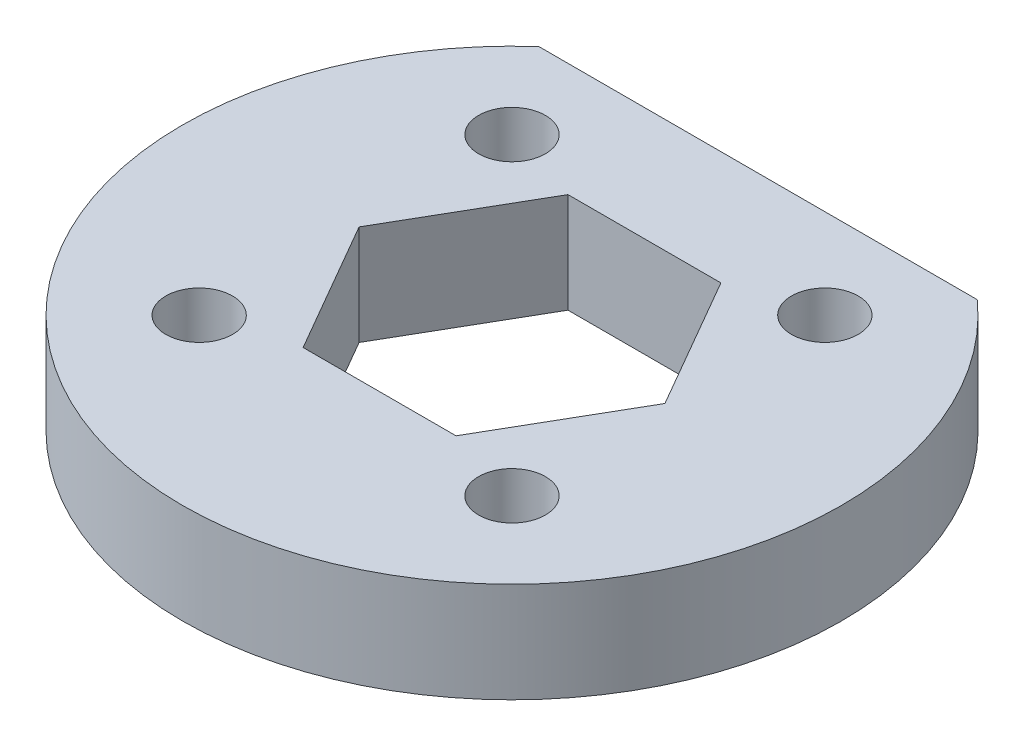
ISO-10303-21;
HEADER;
FILE_DESCRIPTION(('STEP AP214'),'2;1');
FILE_NAME('part.step','',(''),(''),'','','');
FILE_SCHEMA(('AUTOMOTIVE_DESIGN { 1 0 10303 214 1 1 1 1 }'));
ENDSEC;
DATA;
#1=APPLICATION_CONTEXT('core data for automotive mechanical design processes');
#2=APPLICATION_PROTOCOL_DEFINITION('international standard','automotive_design',2000,#1);
#3=PRODUCT_CONTEXT('',#1,'mechanical');
#4=PRODUCT('Part','Part','',(#3));
#5=PRODUCT_RELATED_PRODUCT_CATEGORY('part','',(#4));
#6=PRODUCT_DEFINITION_FORMATION('','',#4);
#7=PRODUCT_DEFINITION_CONTEXT('part definition',#1,'design');
#8=PRODUCT_DEFINITION('design','',#6,#7);
#9=PRODUCT_DEFINITION_SHAPE('','',#8);
#10=(LENGTH_UNIT() NAMED_UNIT(*) SI_UNIT(.MILLI.,.METRE.));
#11=(NAMED_UNIT(*) PLANE_ANGLE_UNIT() SI_UNIT($,.RADIAN.));
#12=(NAMED_UNIT(*) SI_UNIT($,.STERADIAN.) SOLID_ANGLE_UNIT());
#13=UNCERTAINTY_MEASURE_WITH_UNIT(LENGTH_MEASURE(1.E-05),#10,'distance_accuracy_value','');
#14=(GEOMETRIC_REPRESENTATION_CONTEXT(3) GLOBAL_UNCERTAINTY_ASSIGNED_CONTEXT((#13)) GLOBAL_UNIT_ASSIGNED_CONTEXT((#10,
#11,#12)) REPRESENTATION_CONTEXT('',''));
#15=CARTESIAN_POINT('',(0.,0.,0.));
#16=DIRECTION('',(0.,0.,1.));
#17=DIRECTION('',(1.,0.,0.));
#18=AXIS2_PLACEMENT_3D('',#15,#16,#17);
#19=CARTESIAN_POINT('',(0.,0.,0.));
#20=DIRECTION('',(0.,1.,0.));
#21=DIRECTION('',(1.,0.,0.));
#22=AXIS2_PLACEMENT_3D('',#19,#20,#21);
#23=PLANE('',#22);
#24=CARTESIAN_POINT('',(0.,0.,0.));
#25=DIRECTION('',(0.,-1.,0.));
#26=DIRECTION('',(0.665008887927277,0.,-0.746835443037974));
#27=AXIS2_PLACEMENT_3D('',#24,#25,#26);
#28=CIRCLE('',#27,15.8);
#29=CARTESIAN_POINT('',(10.50714042925,0.,-11.8));
#30=VERTEX_POINT('',#29);
#31=CARTESIAN_POINT('',(-10.50714042925,0.,-11.8));
#32=VERTEX_POINT('',#31);
#33=EDGE_CURVE('E11',#30,#32,#28,.T.);
#34=ORIENTED_EDGE('',*,*,#33,.T.);
#35=DIRECTION('',(1.,0.,0.));
#36=VECTOR('',#35,1.);
#37=CARTESIAN_POINT('',(-10.50714042925,0.,-11.8));
#38=LINE('',#37,#36);
#39=EDGE_CURVE('E27',#32,#30,#38,.T.);
#40=ORIENTED_EDGE('',*,*,#39,.T.);
#41=EDGE_LOOP('',(#34,#40));
#42=FACE_BOUND('',#41,.T.);
#43=DIRECTION('',(0.500000000000017,0.,0.866025403784429));
#44=VECTOR('',#43,1.);
#45=CARTESIAN_POINT('',(-7.332348418708,0.,0.));
#46=LINE('',#45,#44);
#47=CARTESIAN_POINT('',(-7.332348418708,0.,0.));
#48=VERTEX_POINT('',#47);
#49=CARTESIAN_POINT('',(-3.666174209354,0.,6.35));
#50=VERTEX_POINT('',#49);
#51=EDGE_CURVE('E334',#48,#50,#46,.T.);
#52=ORIENTED_EDGE('',*,*,#51,.T.);
#53=DIRECTION('',(1.,0.,0.));
#54=VECTOR('',#53,1.);
#55=CARTESIAN_POINT('',(-3.666174209354,0.,6.35));
#56=LINE('',#55,#54);
#57=CARTESIAN_POINT('',(3.666174209354,0.,6.35));
#58=VERTEX_POINT('',#57);
#59=EDGE_CURVE('E331',#50,#58,#56,.T.);
#60=ORIENTED_EDGE('',*,*,#59,.T.);
#61=DIRECTION('',(0.500000000000017,0.,-0.866025403784429));
#62=VECTOR('',#61,1.);
#63=CARTESIAN_POINT('',(3.666174209354,0.,6.35));
#64=LINE('',#63,#62);
#65=CARTESIAN_POINT('',(7.332348418708,0.,0.));
#66=VERTEX_POINT('',#65);
#67=EDGE_CURVE('E327',#58,#66,#64,.T.);
#68=ORIENTED_EDGE('',*,*,#67,.T.);
#69=DIRECTION('',(-0.500000000000017,0.,-0.866025403784429));
#70=VECTOR('',#69,1.);
#71=CARTESIAN_POINT('',(7.332348418708,0.,0.));
#72=LINE('',#71,#70);
#73=CARTESIAN_POINT('',(3.666174209354,0.,-6.35));
#74=VERTEX_POINT('',#73);
#75=EDGE_CURVE('E326',#66,#74,#72,.T.);
#76=ORIENTED_EDGE('',*,*,#75,.T.);
#77=DIRECTION('',(-1.,0.,0.));
#78=VECTOR('',#77,1.);
#79=CARTESIAN_POINT('',(3.666174209354,0.,-6.35));
#80=LINE('',#79,#78);
#81=CARTESIAN_POINT('',(-3.666174209354,0.,-6.35));
#82=VERTEX_POINT('',#81);
#83=EDGE_CURVE('E315',#74,#82,#80,.T.);
#84=ORIENTED_EDGE('',*,*,#83,.T.);
#85=DIRECTION('',(-0.500000000000017,0.,0.866025403784429));
#86=VECTOR('',#85,1.);
#87=CARTESIAN_POINT('',(-3.666174209354,0.,-6.35));
#88=LINE('',#87,#86);
#89=EDGE_CURVE('E104',#82,#48,#88,.T.);
#90=ORIENTED_EDGE('',*,*,#89,.T.);
#91=EDGE_LOOP('',(#52,#60,#68,#76,#84,#90));
#92=FACE_BOUND('',#91,.T.);
#93=CARTESIAN_POINT('',(-7.5,0.,-7.5));
#94=DIRECTION('',(0.,-1.,0.));
#95=DIRECTION('',(-1.,0.,0.));
#96=AXIS2_PLACEMENT_3D('',#93,#94,#95);
#97=CIRCLE('',#96,1.6);
#98=CARTESIAN_POINT('',(-9.1,0.,-7.5));
#99=VERTEX_POINT('',#98);
#100=EDGE_CURVE('E94',#99,#99,#97,.T.);
#101=ORIENTED_EDGE('',*,*,#100,.F.);
#102=EDGE_LOOP('',(#101));
#103=FACE_BOUND('',#102,.T.);
#104=CARTESIAN_POINT('',(-7.5,0.,7.5));
#105=DIRECTION('',(0.,-1.,0.));
#106=DIRECTION('',(0.,0.,1.));
#107=AXIS2_PLACEMENT_3D('',#104,#105,#106);
#108=CIRCLE('',#107,1.6);
#109=CARTESIAN_POINT('',(-7.5,0.,9.1));
#110=VERTEX_POINT('',#109);
#111=EDGE_CURVE('E96',#110,#110,#108,.T.);
#112=ORIENTED_EDGE('',*,*,#111,.F.);
#113=EDGE_LOOP('',(#112));
#114=FACE_BOUND('',#113,.T.);
#115=CARTESIAN_POINT('',(7.5,0.,7.5));
#116=DIRECTION('',(0.,-1.,0.));
#117=DIRECTION('',(1.,0.,0.));
#118=AXIS2_PLACEMENT_3D('',#115,#116,#117);
#119=CIRCLE('',#118,1.6);
#120=CARTESIAN_POINT('',(9.1,0.,7.5));
#121=VERTEX_POINT('',#120);
#122=EDGE_CURVE('E101',#121,#121,#119,.T.);
#123=ORIENTED_EDGE('',*,*,#122,.F.);
#124=EDGE_LOOP('',(#123));
#125=FACE_BOUND('',#124,.T.);
#126=CARTESIAN_POINT('',(7.5,0.,-7.5));
#127=DIRECTION('',(0.,-1.,0.));
#128=DIRECTION('',(0.,0.,-1.));
#129=AXIS2_PLACEMENT_3D('',#126,#127,#128);
#130=CIRCLE('',#129,1.6);
#131=CARTESIAN_POINT('',(7.5,0.,-9.1));
#132=VERTEX_POINT('',#131);
#133=EDGE_CURVE('E109',#132,#132,#130,.T.);
#134=ORIENTED_EDGE('',*,*,#133,.F.);
#135=EDGE_LOOP('',(#134));
#136=FACE_BOUND('',#135,.T.);
#137=ADVANCED_FACE('F17',(#42,#92,#103,#114,#125,#136),#23,.F.);
#138=CARTESIAN_POINT('',(-3.666174209354,4.8,-6.35));
#139=DIRECTION('',(-0.866025403784429,0.,-0.500000000000017));
#140=DIRECTION('',(-0.500000000000017,0.,0.866025403784429));
#141=AXIS2_PLACEMENT_3D('',#138,#139,#140);
#142=PLANE('',#141);
#143=DIRECTION('',(0.,-1.,0.));
#144=VECTOR('',#143,1.);
#145=CARTESIAN_POINT('',(-3.666174209354,4.8,-6.35));
#146=LINE('',#145,#144);
#147=CARTESIAN_POINT('',(-3.666174209354,4.8,-6.35));
#148=VERTEX_POINT('',#147);
#149=EDGE_CURVE('E89',#148,#82,#146,.T.);
#150=ORIENTED_EDGE('',*,*,#149,.F.);
#151=DIRECTION('',(-0.500000000000017,0.,0.866025403784429));
#152=VECTOR('',#151,1.);
#153=CARTESIAN_POINT('',(-3.666174209354,4.8,-6.35));
#154=LINE('',#153,#152);
#155=CARTESIAN_POINT('',(-7.332348418708,4.8,0.));
#156=VERTEX_POINT('',#155);
#157=EDGE_CURVE('E115',#148,#156,#154,.T.);
#158=ORIENTED_EDGE('',*,*,#157,.T.);
#159=DIRECTION('',(0.,-1.,0.));
#160=VECTOR('',#159,1.);
#161=CARTESIAN_POINT('',(-7.332348418708,4.8,0.));
#162=LINE('',#161,#160);
#163=EDGE_CURVE('E118',#156,#48,#162,.T.);
#164=ORIENTED_EDGE('',*,*,#163,.T.);
#165=ORIENTED_EDGE('',*,*,#89,.F.);
#166=EDGE_LOOP('',(#150,#158,#164,#165));
#167=FACE_BOUND('',#166,.T.);
#168=ADVANCED_FACE('F170',(#167),#142,.F.);
#169=CARTESIAN_POINT('',(-7.332348418708,4.8,0.));
#170=DIRECTION('',(-0.866025403784429,0.,0.500000000000017));
#171=DIRECTION('',(0.500000000000017,0.,0.866025403784429));
#172=AXIS2_PLACEMENT_3D('',#169,#170,#171);
#173=PLANE('',#172);
#174=ORIENTED_EDGE('',*,*,#163,.F.);
#175=DIRECTION('',(0.500000000000017,0.,0.866025403784429));
#176=VECTOR('',#175,1.);
#177=CARTESIAN_POINT('',(-7.332348418708,4.8,0.));
#178=LINE('',#177,#176);
#179=CARTESIAN_POINT('',(-3.666174209354,4.8,6.35));
#180=VERTEX_POINT('',#179);
#181=EDGE_CURVE('E121',#156,#180,#178,.T.);
#182=ORIENTED_EDGE('',*,*,#181,.T.);
#183=DIRECTION('',(0.,-1.,0.));
#184=VECTOR('',#183,1.);
#185=CARTESIAN_POINT('',(-3.666174209354,4.8,6.35));
#186=LINE('',#185,#184);
#187=EDGE_CURVE('E124',#180,#50,#186,.T.);
#188=ORIENTED_EDGE('',*,*,#187,.T.);
#189=ORIENTED_EDGE('',*,*,#51,.F.);
#190=EDGE_LOOP('',(#174,#182,#188,#189));
#191=FACE_BOUND('',#190,.T.);
#192=ADVANCED_FACE('F176',(#191),#173,.F.);
#193=CARTESIAN_POINT('',(-3.666174209354,4.8,6.35));
#194=DIRECTION('',(0.,0.,1.));
#195=DIRECTION('',(1.,0.,0.));
#196=AXIS2_PLACEMENT_3D('',#193,#194,#195);
#197=PLANE('',#196);
#198=ORIENTED_EDGE('',*,*,#187,.F.);
#199=DIRECTION('',(1.,0.,0.));
#200=VECTOR('',#199,1.);
#201=CARTESIAN_POINT('',(-3.666174209354,4.8,6.35));
#202=LINE('',#201,#200);
#203=CARTESIAN_POINT('',(3.666174209354,4.8,6.35));
#204=VERTEX_POINT('',#203);
#205=EDGE_CURVE('E127',#180,#204,#202,.T.);
#206=ORIENTED_EDGE('',*,*,#205,.T.);
#207=DIRECTION('',(0.,-1.,0.));
#208=VECTOR('',#207,1.);
#209=CARTESIAN_POINT('',(3.666174209354,4.8,6.35));
#210=LINE('',#209,#208);
#211=EDGE_CURVE('E130',#204,#58,#210,.T.);
#212=ORIENTED_EDGE('',*,*,#211,.T.);
#213=ORIENTED_EDGE('',*,*,#59,.F.);
#214=EDGE_LOOP('',(#198,#206,#212,#213));
#215=FACE_BOUND('',#214,.T.);
#216=ADVANCED_FACE('F183',(#215),#197,.F.);
#217=CARTESIAN_POINT('',(3.666174209354,4.8,6.35));
#218=DIRECTION('',(0.866025403784429,0.,0.500000000000017));
#219=DIRECTION('',(0.500000000000017,0.,-0.866025403784429));
#220=AXIS2_PLACEMENT_3D('',#217,#218,#219);
#221=PLANE('',#220);
#222=ORIENTED_EDGE('',*,*,#211,.F.);
#223=DIRECTION('',(0.500000000000017,0.,-0.866025403784429));
#224=VECTOR('',#223,1.);
#225=CARTESIAN_POINT('',(3.666174209354,4.8,6.35));
#226=LINE('',#225,#224);
#227=CARTESIAN_POINT('',(7.332348418708,4.8,0.));
#228=VERTEX_POINT('',#227);
#229=EDGE_CURVE('E133',#204,#228,#226,.T.);
#230=ORIENTED_EDGE('',*,*,#229,.T.);
#231=DIRECTION('',(0.,-1.,0.));
#232=VECTOR('',#231,1.);
#233=CARTESIAN_POINT('',(7.332348418708,4.8,0.));
#234=LINE('',#233,#232);
#235=EDGE_CURVE('E136',#228,#66,#234,.T.);
#236=ORIENTED_EDGE('',*,*,#235,.T.);
#237=ORIENTED_EDGE('',*,*,#67,.F.);
#238=EDGE_LOOP('',(#222,#230,#236,#237));
#239=FACE_BOUND('',#238,.T.);
#240=ADVANCED_FACE('F187',(#239),#221,.F.);
#241=CARTESIAN_POINT('',(7.332348418708,4.8,0.));
#242=DIRECTION('',(0.866025403784429,0.,-0.500000000000017));
#243=DIRECTION('',(-0.500000000000017,0.,-0.866025403784429));
#244=AXIS2_PLACEMENT_3D('',#241,#242,#243);
#245=PLANE('',#244);
#246=ORIENTED_EDGE('',*,*,#235,.F.);
#247=DIRECTION('',(-0.500000000000017,0.,-0.866025403784429));
#248=VECTOR('',#247,1.);
#249=CARTESIAN_POINT('',(7.332348418708,4.8,0.));
#250=LINE('',#249,#248);
#251=CARTESIAN_POINT('',(3.666174209354,4.8,-6.35));
#252=VERTEX_POINT('',#251);
#253=EDGE_CURVE('E139',#228,#252,#250,.T.);
#254=ORIENTED_EDGE('',*,*,#253,.T.);
#255=DIRECTION('',(0.,-1.,0.));
#256=VECTOR('',#255,1.);
#257=CARTESIAN_POINT('',(3.666174209354,4.8,-6.35));
#258=LINE('',#257,#256);
#259=EDGE_CURVE('E142',#252,#74,#258,.T.);
#260=ORIENTED_EDGE('',*,*,#259,.T.);
#261=ORIENTED_EDGE('',*,*,#75,.F.);
#262=EDGE_LOOP('',(#246,#254,#260,#261));
#263=FACE_BOUND('',#262,.T.);
#264=ADVANCED_FACE('F191',(#263),#245,.F.);
#265=CARTESIAN_POINT('',(3.666174209354,4.8,-6.35));
#266=DIRECTION('',(0.,0.,-1.));
#267=DIRECTION('',(-1.,0.,0.));
#268=AXIS2_PLACEMENT_3D('',#265,#266,#267);
#269=PLANE('',#268);
#270=ORIENTED_EDGE('',*,*,#259,.F.);
#271=DIRECTION('',(-1.,0.,0.));
#272=VECTOR('',#271,1.);
#273=CARTESIAN_POINT('',(3.666174209354,4.8,-6.35));
#274=LINE('',#273,#272);
#275=EDGE_CURVE('E114',#252,#148,#274,.T.);
#276=ORIENTED_EDGE('',*,*,#275,.T.);
#277=ORIENTED_EDGE('',*,*,#149,.T.);
#278=ORIENTED_EDGE('',*,*,#83,.F.);
#279=EDGE_LOOP('',(#270,#276,#277,#278));
#280=FACE_BOUND('',#279,.T.);
#281=ADVANCED_FACE('F195',(#280),#269,.F.);
#282=CARTESIAN_POINT('',(0.,4.8,0.));
#283=DIRECTION('',(0.,1.,0.));
#284=DIRECTION('',(1.,0.,0.));
#285=AXIS2_PLACEMENT_3D('',#282,#283,#284);
#286=PLANE('',#285);
#287=CARTESIAN_POINT('',(0.,4.8,0.));
#288=DIRECTION('',(0.,1.,0.));
#289=DIRECTION('',(-0.665008887927277,0.,-0.746835443037974));
#290=AXIS2_PLACEMENT_3D('',#287,#288,#289);
#291=CIRCLE('',#290,15.8);
#292=CARTESIAN_POINT('',(-10.50714042925,4.8,-11.8));
#293=VERTEX_POINT('',#292);
#294=CARTESIAN_POINT('',(10.50714042925,4.8,-11.8));
#295=VERTEX_POINT('',#294);
#296=EDGE_CURVE('E85',#293,#295,#291,.T.);
#297=ORIENTED_EDGE('',*,*,#296,.T.);
#298=DIRECTION('',(1.,0.,0.));
#299=VECTOR('',#298,1.);
#300=CARTESIAN_POINT('',(-10.50714042925,4.8,-11.8));
#301=LINE('',#300,#299);
#302=EDGE_CURVE('E78',#293,#295,#301,.T.);
#303=ORIENTED_EDGE('',*,*,#302,.F.);
#304=EDGE_LOOP('',(#297,#303));
#305=FACE_BOUND('',#304,.T.);
#306=ORIENTED_EDGE('',*,*,#275,.F.);
#307=ORIENTED_EDGE('',*,*,#253,.F.);
#308=ORIENTED_EDGE('',*,*,#229,.F.);
#309=ORIENTED_EDGE('',*,*,#205,.F.);
#310=ORIENTED_EDGE('',*,*,#181,.F.);
#311=ORIENTED_EDGE('',*,*,#157,.F.);
#312=EDGE_LOOP('',(#306,#307,#308,#309,#310,#311));
#313=FACE_BOUND('',#312,.T.);
#314=CARTESIAN_POINT('',(-7.5,4.8,-7.5));
#315=DIRECTION('',(0.,-1.,0.));
#316=DIRECTION('',(-1.,0.,0.));
#317=AXIS2_PLACEMENT_3D('',#314,#315,#316);
#318=CIRCLE('',#317,1.6);
#319=CARTESIAN_POINT('',(-9.1,4.8,-7.5));
#320=VERTEX_POINT('',#319);
#321=EDGE_CURVE('E90',#320,#320,#318,.T.);
#322=ORIENTED_EDGE('',*,*,#321,.T.);
#323=EDGE_LOOP('',(#322));
#324=FACE_BOUND('',#323,.T.);
#325=CARTESIAN_POINT('',(-7.5,4.8,7.5));
#326=DIRECTION('',(0.,-1.,0.));
#327=DIRECTION('',(0.,0.,1.));
#328=AXIS2_PLACEMENT_3D('',#325,#326,#327);
#329=CIRCLE('',#328,1.6);
#330=CARTESIAN_POINT('',(-7.5,4.8,9.1));
#331=VERTEX_POINT('',#330);
#332=EDGE_CURVE('E149',#331,#331,#329,.T.);
#333=ORIENTED_EDGE('',*,*,#332,.T.);
#334=EDGE_LOOP('',(#333));
#335=FACE_BOUND('',#334,.T.);
#336=CARTESIAN_POINT('',(7.5,4.8,7.5));
#337=DIRECTION('',(0.,-1.,0.));
#338=DIRECTION('',(1.,0.,0.));
#339=AXIS2_PLACEMENT_3D('',#336,#337,#338);
#340=CIRCLE('',#339,1.6);
#341=CARTESIAN_POINT('',(9.1,4.8,7.5));
#342=VERTEX_POINT('',#341);
#343=EDGE_CURVE('E152',#342,#342,#340,.T.);
#344=ORIENTED_EDGE('',*,*,#343,.T.);
#345=EDGE_LOOP('',(#344));
#346=FACE_BOUND('',#345,.T.);
#347=CARTESIAN_POINT('',(7.5,4.8,-7.5));
#348=DIRECTION('',(0.,-1.,0.));
#349=DIRECTION('',(0.,0.,-1.));
#350=AXIS2_PLACEMENT_3D('',#347,#348,#349);
#351=CIRCLE('',#350,1.6);
#352=CARTESIAN_POINT('',(7.5,4.8,-9.1));
#353=VERTEX_POINT('',#352);
#354=EDGE_CURVE('E155',#353,#353,#351,.T.);
#355=ORIENTED_EDGE('',*,*,#354,.T.);
#356=EDGE_LOOP('',(#355));
#357=FACE_BOUND('',#356,.T.);
#358=ADVANCED_FACE('F86',(#305,#313,#324,#335,#346,#357),#286,.T.);
#359=CARTESIAN_POINT('',(-10.50714042925,4.8,-11.8));
#360=DIRECTION('',(0.,0.,1.));
#361=DIRECTION('',(1.,0.,0.));
#362=AXIS2_PLACEMENT_3D('',#359,#360,#361);
#363=PLANE('',#362);
#364=DIRECTION('',(0.,1.,0.));
#365=VECTOR('',#364,1.);
#366=CARTESIAN_POINT('',(-10.50714042925,0.,-11.8));
#367=LINE('',#366,#365);
#368=EDGE_CURVE('E83',#32,#293,#367,.T.);
#369=ORIENTED_EDGE('',*,*,#368,.T.);
#370=ORIENTED_EDGE('',*,*,#302,.T.);
#371=DIRECTION('',(0.,1.,0.));
#372=VECTOR('',#371,1.);
#373=CARTESIAN_POINT('',(10.50714042925,0.,-11.8));
#374=LINE('',#373,#372);
#375=EDGE_CURVE('E21',#30,#295,#374,.T.);
#376=ORIENTED_EDGE('',*,*,#375,.F.);
#377=ORIENTED_EDGE('',*,*,#39,.F.);
#378=EDGE_LOOP('',(#369,#370,#376,#377));
#379=FACE_BOUND('',#378,.T.);
#380=ADVANCED_FACE('F80',(#379),#363,.F.);
#381=CARTESIAN_POINT('',(0.,0.,0.));
#382=DIRECTION('',(0.,1.,0.));
#383=DIRECTION('',(1.,0.,0.));
#384=AXIS2_PLACEMENT_3D('',#381,#382,#383);
#385=CYLINDRICAL_SURFACE('',#384,15.8);
#386=ORIENTED_EDGE('',*,*,#375,.T.);
#387=ORIENTED_EDGE('',*,*,#296,.F.);
#388=ORIENTED_EDGE('',*,*,#368,.F.);
#389=ORIENTED_EDGE('',*,*,#33,.F.);
#390=EDGE_LOOP('',(#386,#387,#388,#389));
#391=FACE_BOUND('',#390,.T.);
#392=ADVANCED_FACE('F93',(#391),#385,.T.);
#393=CARTESIAN_POINT('',(-7.5,4.8,-7.5));
#394=DIRECTION('',(0.,-1.,0.));
#395=DIRECTION('',(1.,0.,0.));
#396=AXIS2_PLACEMENT_3D('',#393,#394,#395);
#397=CYLINDRICAL_SURFACE('',#396,1.6);
#398=ORIENTED_EDGE('',*,*,#100,.T.);
#399=EDGE_LOOP('',(#398));
#400=FACE_BOUND('',#399,.T.);
#401=ORIENTED_EDGE('',*,*,#321,.F.);
#402=EDGE_LOOP('',(#401));
#403=FACE_BOUND('',#402,.T.);
#404=ADVANCED_FACE('F206',(#400,#403),#397,.F.);
#405=CARTESIAN_POINT('',(-7.5,4.8,7.5));
#406=DIRECTION('',(0.,-1.,0.));
#407=DIRECTION('',(0.,0.,-1.));
#408=AXIS2_PLACEMENT_3D('',#405,#406,#407);
#409=CYLINDRICAL_SURFACE('',#408,1.6);
#410=ORIENTED_EDGE('',*,*,#111,.T.);
#411=EDGE_LOOP('',(#410));
#412=FACE_BOUND('',#411,.T.);
#413=ORIENTED_EDGE('',*,*,#332,.F.);
#414=EDGE_LOOP('',(#413));
#415=FACE_BOUND('',#414,.T.);
#416=ADVANCED_FACE('F167',(#412,#415),#409,.F.);
#417=CARTESIAN_POINT('',(7.5,4.8,7.5));
#418=DIRECTION('',(0.,-1.,0.));
#419=DIRECTION('',(-1.,0.,0.));
#420=AXIS2_PLACEMENT_3D('',#417,#418,#419);
#421=CYLINDRICAL_SURFACE('',#420,1.6);
#422=ORIENTED_EDGE('',*,*,#122,.T.);
#423=EDGE_LOOP('',(#422));
#424=FACE_BOUND('',#423,.T.);
#425=ORIENTED_EDGE('',*,*,#343,.F.);
#426=EDGE_LOOP('',(#425));
#427=FACE_BOUND('',#426,.T.);
#428=ADVANCED_FACE('F161',(#424,#427),#421,.F.);
#429=CARTESIAN_POINT('',(7.5,4.8,-7.5));
#430=DIRECTION('',(0.,-1.,0.));
#431=DIRECTION('',(0.,0.,1.));
#432=AXIS2_PLACEMENT_3D('',#429,#430,#431);
#433=CYLINDRICAL_SURFACE('',#432,1.6);
#434=ORIENTED_EDGE('',*,*,#133,.T.);
#435=EDGE_LOOP('',(#434));
#436=FACE_BOUND('',#435,.T.);
#437=ORIENTED_EDGE('',*,*,#354,.F.);
#438=EDGE_LOOP('',(#437));
#439=FACE_BOUND('',#438,.T.);
#440=ADVANCED_FACE('F19',(#436,#439),#433,.F.);
#441=CLOSED_SHELL('',(#137,#168,#192,#216,#240,#264,#281,#358,#380,#392,#404,#416,#428,#440));
#442=MANIFOLD_SOLID_BREP('B1',#441);
#443=ADVANCED_BREP_SHAPE_REPRESENTATION('',(#18,#442),#14);
#444=SHAPE_DEFINITION_REPRESENTATION(#9,#443);
ENDSEC;
END-ISO-10303-21;
